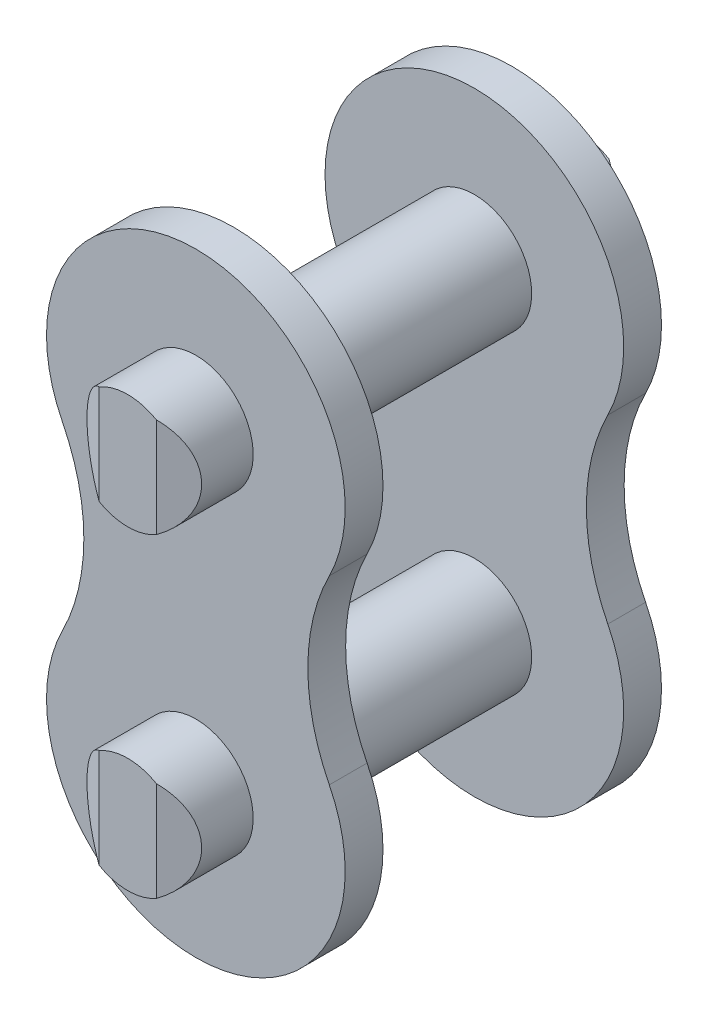
ISO-10303-21;
HEADER;
FILE_DESCRIPTION(('STEP AP214'),'2;1');
FILE_NAME('part.step','',(''),(''),'','','');
FILE_SCHEMA(('AUTOMOTIVE_DESIGN { 1 0 10303 214 1 1 1 1 }'));
ENDSEC;
DATA;
#1=APPLICATION_CONTEXT('core data for automotive mechanical design processes');
#2=APPLICATION_PROTOCOL_DEFINITION('international standard','automotive_design',2000,#1);
#3=PRODUCT_CONTEXT('',#1,'mechanical');
#4=PRODUCT('Part','Part','',(#3));
#5=PRODUCT_RELATED_PRODUCT_CATEGORY('part','',(#4));
#6=PRODUCT_DEFINITION_FORMATION('','',#4);
#7=PRODUCT_DEFINITION_CONTEXT('part definition',#1,'design');
#8=PRODUCT_DEFINITION('design','',#6,#7);
#9=PRODUCT_DEFINITION_SHAPE('','',#8);
#10=(LENGTH_UNIT() NAMED_UNIT(*) SI_UNIT(.MILLI.,.METRE.));
#11=(NAMED_UNIT(*) PLANE_ANGLE_UNIT() SI_UNIT($,.RADIAN.));
#12=(NAMED_UNIT(*) SI_UNIT($,.STERADIAN.) SOLID_ANGLE_UNIT());
#13=UNCERTAINTY_MEASURE_WITH_UNIT(LENGTH_MEASURE(1.E-05),#10,'distance_accuracy_value','');
#14=(GEOMETRIC_REPRESENTATION_CONTEXT(3) GLOBAL_UNCERTAINTY_ASSIGNED_CONTEXT((#13)) GLOBAL_UNIT_ASSIGNED_CONTEXT((#10,
#11,#12)) REPRESENTATION_CONTEXT('',''));
#15=CARTESIAN_POINT('',(0.,0.,0.));
#16=DIRECTION('',(0.,0.,1.));
#17=DIRECTION('',(1.,0.,0.));
#18=AXIS2_PLACEMENT_3D('',#15,#16,#17);
#19=CARTESIAN_POINT('',(81.9245250000066,718.446356901912,-131.392489073474));
#20=DIRECTION('',(0.5,0.,0.866025403784439));
#21=DIRECTION('',(0.,-1.,0.));
#22=AXIS2_PLACEMENT_3D('',#19,#20,#21);
#23=PLANE('',#22);
#24=CARTESIAN_POINT('',(82.7913000000066,732.949015752861,-131.892921853051));
#25=DIRECTION('',(-0.5,0.,-0.866025403784439));
#26=DIRECTION('',(-0.866025403784439,0.,0.5));
#27=AXIS2_PLACEMENT_3D('',#24,#25,#26);
#28=ELLIPSE('',#27,1.3344874122049,1.1557);
#29=CARTESIAN_POINT('',(82.2134500000066,731.948150193707,-131.5593));
#30=VERTEX_POINT('',#29);
#31=CARTESIAN_POINT('',(82.2134500000066,733.949881312015,-131.5593));
#32=VERTEX_POINT('',#31);
#33=EDGE_CURVE('E212',#30,#32,#28,.T.);
#34=ORIENTED_EDGE('',*,*,#33,.T.);
#35=DIRECTION('',(0.,1.,0.));
#36=VECTOR('',#35,1.);
#37=CARTESIAN_POINT('',(82.2134500000066,718.446356901912,-131.5593));
#38=LINE('',#37,#36);
#39=EDGE_CURVE('E354',#30,#32,#38,.T.);
#40=ORIENTED_EDGE('',*,*,#39,.F.);
#41=EDGE_LOOP('',(#34,#40));
#42=FACE_BOUND('',#41,.T.);
#43=ADVANCED_FACE('F17',(#42),#23,.F.);
#44=CARTESIAN_POINT('',(83.6580750000066,718.446356901912,-131.392489073474));
#45=DIRECTION('',(0.5,0.,-0.866025403784439));
#46=DIRECTION('',(0.,-1.,0.));
#47=AXIS2_PLACEMENT_3D('',#44,#45,#46);
#48=PLANE('',#47);
#49=CARTESIAN_POINT('',(82.7913000000066,732.949015752861,-131.892921853051));
#50=DIRECTION('',(-0.5,0.,0.866025403784439));
#51=DIRECTION('',(0.866025403784439,0.,0.5));
#52=AXIS2_PLACEMENT_3D('',#49,#50,#51);
#53=ELLIPSE('',#52,1.3344874122049,1.1557);
#54=CARTESIAN_POINT('',(83.3691500000066,731.948150193707,-131.5593));
#55=VERTEX_POINT('',#54);
#56=CARTESIAN_POINT('',(83.3691500000066,733.949881312015,-131.5593));
#57=VERTEX_POINT('',#56);
#58=EDGE_CURVE('E211',#55,#57,#53,.T.);
#59=ORIENTED_EDGE('',*,*,#58,.F.);
#60=DIRECTION('',(0.,1.,0.));
#61=VECTOR('',#60,1.);
#62=CARTESIAN_POINT('',(83.3691500000066,718.446356901912,-131.5593));
#63=LINE('',#62,#61);
#64=EDGE_CURVE('E358',#55,#57,#63,.T.);
#65=ORIENTED_EDGE('',*,*,#64,.T.);
#66=EDGE_LOOP('',(#59,#65));
#67=FACE_BOUND('',#66,.T.);
#68=ADVANCED_FACE('F425',(#67),#48,.T.);
#69=CARTESIAN_POINT('',(81.9245250000066,718.446356901912,-131.392489073474));
#70=DIRECTION('',(0.5,0.,0.866025403784439));
#71=DIRECTION('',(0.,-1.,0.));
#72=AXIS2_PLACEMENT_3D('',#69,#70,#71);
#73=PLANE('',#72);
#74=CARTESIAN_POINT('',(82.7913000000066,739.299015752861,-131.892921853051));
#75=DIRECTION('',(-0.5,0.,-0.866025403784439));
#76=DIRECTION('',(-0.866025403784439,0.,0.5));
#77=AXIS2_PLACEMENT_3D('',#74,#75,#76);
#78=ELLIPSE('',#77,1.3344874122049,1.1557);
#79=CARTESIAN_POINT('',(82.2134500000066,738.298150193707,-131.5593));
#80=VERTEX_POINT('',#79);
#81=CARTESIAN_POINT('',(82.2134500000066,740.299881312015,-131.5593));
#82=VERTEX_POINT('',#81);
#83=EDGE_CURVE('E307',#80,#82,#78,.T.);
#84=ORIENTED_EDGE('',*,*,#83,.T.);
#85=DIRECTION('',(0.,1.,0.));
#86=VECTOR('',#85,1.);
#87=CARTESIAN_POINT('',(82.2134500000066,718.446356901912,-131.5593));
#88=LINE('',#87,#86);
#89=EDGE_CURVE('E297',#80,#82,#88,.T.);
#90=ORIENTED_EDGE('',*,*,#89,.F.);
#91=EDGE_LOOP('',(#84,#90));
#92=FACE_BOUND('',#91,.T.);
#93=ADVANCED_FACE('F431',(#92),#73,.F.);
#94=CARTESIAN_POINT('',(83.6580750000066,718.446356901912,-131.392489073474));
#95=DIRECTION('',(0.5,0.,-0.866025403784439));
#96=DIRECTION('',(0.,-1.,0.));
#97=AXIS2_PLACEMENT_3D('',#94,#95,#96);
#98=PLANE('',#97);
#99=CARTESIAN_POINT('',(82.7913000000066,739.299015752861,-131.892921853051));
#100=DIRECTION('',(-0.5,0.,0.866025403784439));
#101=DIRECTION('',(0.866025403784439,0.,0.5));
#102=AXIS2_PLACEMENT_3D('',#99,#100,#101);
#103=ELLIPSE('',#102,1.3344874122049,1.1557);
#104=CARTESIAN_POINT('',(83.3691500000066,738.298150193707,-131.5593));
#105=VERTEX_POINT('',#104);
#106=CARTESIAN_POINT('',(83.3691500000066,740.299881312015,-131.5593));
#107=VERTEX_POINT('',#106);
#108=EDGE_CURVE('E306',#105,#107,#103,.T.);
#109=ORIENTED_EDGE('',*,*,#108,.F.);
#110=DIRECTION('',(0.,1.,0.));
#111=VECTOR('',#110,1.);
#112=CARTESIAN_POINT('',(83.3691500000066,718.446356901912,-131.5593));
#113=LINE('',#112,#111);
#114=EDGE_CURVE('E300',#105,#107,#113,.T.);
#115=ORIENTED_EDGE('',*,*,#114,.T.);
#116=EDGE_LOOP('',(#109,#115));
#117=FACE_BOUND('',#116,.T.);
#118=ADVANCED_FACE('F418',(#117),#98,.T.);
#119=CARTESIAN_POINT('',(82.7913000000066,736.124015752861,-129.4257));
#120=DIRECTION('',(0.,0.,-1.));
#121=DIRECTION('',(0.,-1.,0.));
#122=AXIS2_PLACEMENT_3D('',#119,#120,#121);
#123=PLANE('',#122);
#124=CARTESIAN_POINT('',(82.7913000000066,732.949015752861,-129.4257));
#125=DIRECTION('',(0.,0.,1.));
#126=DIRECTION('',(0.,1.,0.));
#127=AXIS2_PLACEMENT_3D('',#124,#125,#126);
#128=CIRCLE('',#127,1.1557);
#129=CARTESIAN_POINT('',(82.7913000000066,734.104715752861,-129.4257));
#130=VERTEX_POINT('',#129);
#131=EDGE_CURVE('E338',#130,#130,#128,.T.);
#132=ORIENTED_EDGE('',*,*,#131,.F.);
#133=EDGE_LOOP('',(#132));
#134=FACE_BOUND('',#133,.T.);
#135=CARTESIAN_POINT('',(82.7913000000066,739.299015752861,-129.4257));
#136=DIRECTION('',(0.,0.,1.));
#137=DIRECTION('',(0.,1.,0.));
#138=AXIS2_PLACEMENT_3D('',#135,#136,#137);
#139=CIRCLE('',#138,1.1557);
#140=CARTESIAN_POINT('',(82.7913000000066,740.454715752861,-129.4257));
#141=VERTEX_POINT('',#140);
#142=EDGE_CURVE('E335',#141,#141,#139,.T.);
#143=ORIENTED_EDGE('',*,*,#142,.F.);
#144=EDGE_LOOP('',(#143));
#145=FACE_BOUND('',#144,.T.);
#146=CARTESIAN_POINT('',(89.1133747362936,736.124015752861,-129.4257));
#147=DIRECTION('',(0.,0.,1.));
#148=DIRECTION('',(0.,1.,0.));
#149=AXIS2_PLACEMENT_3D('',#146,#147,#148);
#150=CIRCLE('',#149,4.06464973628698);
#151=CARTESIAN_POINT('',(85.4810560209654,737.948197275894,-129.4257));
#152=VERTEX_POINT('',#151);
#153=CARTESIAN_POINT('',(85.4810560209654,734.299834229828,-129.4257));
#154=VERTEX_POINT('',#153);
#155=EDGE_CURVE('E371',#152,#154,#150,.T.);
#156=ORIENTED_EDGE('',*,*,#155,.F.);
#157=CARTESIAN_POINT('',(82.7913000000066,739.299015752861,-129.4257));
#158=DIRECTION('',(0.,0.,1.));
#159=DIRECTION('',(0.,1.,0.));
#160=AXIS2_PLACEMENT_3D('',#157,#158,#159);
#161=CIRCLE('',#160,3.0099);
#162=CARTESIAN_POINT('',(80.1015439790479,737.948197275894,-129.4257));
#163=VERTEX_POINT('',#162);
#164=EDGE_CURVE('E287',#152,#163,#161,.T.);
#165=ORIENTED_EDGE('',*,*,#164,.T.);
#166=CARTESIAN_POINT('',(76.4692252637197,736.124015752861,-129.4257));
#167=DIRECTION('',(0.,0.,1.));
#168=DIRECTION('',(0.,1.,0.));
#169=AXIS2_PLACEMENT_3D('',#166,#167,#168);
#170=CIRCLE('',#169,4.06464973628691);
#171=CARTESIAN_POINT('',(80.1015439790479,734.299834229828,-129.4257));
#172=VERTEX_POINT('',#171);
#173=EDGE_CURVE('E282',#172,#163,#170,.T.);
#174=ORIENTED_EDGE('',*,*,#173,.F.);
#175=CARTESIAN_POINT('',(82.7913000000066,732.949015752861,-129.4257));
#176=DIRECTION('',(0.,0.,1.));
#177=DIRECTION('',(0.,1.,0.));
#178=AXIS2_PLACEMENT_3D('',#175,#176,#177);
#179=CIRCLE('',#178,3.0099);
#180=EDGE_CURVE('E25',#172,#154,#179,.T.);
#181=ORIENTED_EDGE('',*,*,#180,.T.);
#182=EDGE_LOOP('',(#156,#165,#174,#181));
#183=FACE_BOUND('',#182,.T.);
#184=ADVANCED_FACE('F395',(#134,#145,#183),#123,.F.);
#185=CARTESIAN_POINT('',(82.7913000000066,736.124015752861,-130.1877));
#186=DIRECTION('',(0.,0.,-1.));
#187=DIRECTION('',(0.,-1.,0.));
#188=AXIS2_PLACEMENT_3D('',#185,#186,#187);
#189=PLANE('',#188);
#190=CARTESIAN_POINT('',(82.7913000000066,732.949015752861,-130.1877));
#191=DIRECTION('',(0.,0.,1.));
#192=DIRECTION('',(0.,1.,0.));
#193=AXIS2_PLACEMENT_3D('',#190,#191,#192);
#194=CIRCLE('',#193,1.1557);
#195=CARTESIAN_POINT('',(82.7913000000066,734.104715752861,-130.1877));
#196=VERTEX_POINT('',#195);
#197=EDGE_CURVE('E341',#196,#196,#194,.T.);
#198=ORIENTED_EDGE('',*,*,#197,.T.);
#199=EDGE_LOOP('',(#198));
#200=FACE_BOUND('',#199,.T.);
#201=CARTESIAN_POINT('',(82.7913000000066,739.299015752861,-130.1877));
#202=DIRECTION('',(0.,0.,1.));
#203=DIRECTION('',(0.,1.,0.));
#204=AXIS2_PLACEMENT_3D('',#201,#202,#203);
#205=CIRCLE('',#204,1.1557);
#206=CARTESIAN_POINT('',(82.7913000000066,740.454715752861,-130.1877));
#207=VERTEX_POINT('',#206);
#208=EDGE_CURVE('E355',#207,#207,#205,.T.);
#209=ORIENTED_EDGE('',*,*,#208,.T.);
#210=EDGE_LOOP('',(#209));
#211=FACE_BOUND('',#210,.T.);
#212=CARTESIAN_POINT('',(89.1133747362936,736.124015752861,-130.1877));
#213=DIRECTION('',(0.,0.,1.));
#214=DIRECTION('',(0.,1.,0.));
#215=AXIS2_PLACEMENT_3D('',#212,#213,#214);
#216=CIRCLE('',#215,4.06464973628698);
#217=CARTESIAN_POINT('',(85.4810560209654,737.948197275894,-130.1877));
#218=VERTEX_POINT('',#217);
#219=CARTESIAN_POINT('',(85.4810560209654,734.299834229828,-130.1877));
#220=VERTEX_POINT('',#219);
#221=EDGE_CURVE('E293',#218,#220,#216,.T.);
#222=ORIENTED_EDGE('',*,*,#221,.T.);
#223=CARTESIAN_POINT('',(82.7913000000066,732.949015752861,-130.1877));
#224=DIRECTION('',(0.,0.,1.));
#225=DIRECTION('',(0.,1.,0.));
#226=AXIS2_PLACEMENT_3D('',#223,#224,#225);
#227=CIRCLE('',#226,3.0099);
#228=CARTESIAN_POINT('',(80.1015439790479,734.299834229828,-130.1877));
#229=VERTEX_POINT('',#228);
#230=EDGE_CURVE('E11',#229,#220,#227,.T.);
#231=ORIENTED_EDGE('',*,*,#230,.F.);
#232=CARTESIAN_POINT('',(76.4692252637197,736.124015752861,-130.1877));
#233=DIRECTION('',(0.,0.,1.));
#234=DIRECTION('',(0.,1.,0.));
#235=AXIS2_PLACEMENT_3D('',#232,#233,#234);
#236=CIRCLE('',#235,4.06464973628691);
#237=CARTESIAN_POINT('',(80.1015439790479,737.948197275894,-130.1877));
#238=VERTEX_POINT('',#237);
#239=EDGE_CURVE('E285',#229,#238,#236,.T.);
#240=ORIENTED_EDGE('',*,*,#239,.T.);
#241=CARTESIAN_POINT('',(82.7913000000066,739.299015752861,-130.1877));
#242=DIRECTION('',(0.,0.,1.));
#243=DIRECTION('',(0.,1.,0.));
#244=AXIS2_PLACEMENT_3D('',#241,#242,#243);
#245=CIRCLE('',#244,3.0099);
#246=EDGE_CURVE('E291',#218,#238,#245,.T.);
#247=ORIENTED_EDGE('',*,*,#246,.F.);
#248=EDGE_LOOP('',(#222,#231,#240,#247));
#249=FACE_BOUND('',#248,.T.);
#250=ADVANCED_FACE('F408',(#200,#211,#249),#189,.T.);
#251=CARTESIAN_POINT('',(82.7913000000066,732.949015752861,-130.1877));
#252=DIRECTION('',(0.,0.,1.));
#253=DIRECTION('',(0.,-1.,0.));
#254=AXIS2_PLACEMENT_3D('',#251,#252,#253);
#255=CYLINDRICAL_SURFACE('',#254,3.0099);
#256=ORIENTED_EDGE('',*,*,#180,.F.);
#257=DIRECTION('',(0.,0.,1.));
#258=VECTOR('',#257,1.);
#259=CARTESIAN_POINT('',(80.1015439790479,734.299834229828,-130.1877));
#260=LINE('',#259,#258);
#261=EDGE_CURVE('E388',#229,#172,#260,.T.);
#262=ORIENTED_EDGE('',*,*,#261,.F.);
#263=ORIENTED_EDGE('',*,*,#230,.T.);
#264=DIRECTION('',(0.,0.,1.));
#265=VECTOR('',#264,1.);
#266=CARTESIAN_POINT('',(85.4810560209654,734.299834229828,-130.1877));
#267=LINE('',#266,#265);
#268=EDGE_CURVE('E296',#220,#154,#267,.T.);
#269=ORIENTED_EDGE('',*,*,#268,.T.);
#270=EDGE_LOOP('',(#256,#262,#263,#269));
#271=FACE_BOUND('',#270,.T.);
#272=ADVANCED_FACE('F397',(#271),#255,.T.);
#273=CARTESIAN_POINT('',(76.4692252637197,736.124015752861,-130.1877));
#274=DIRECTION('',(0.,0.,1.));
#275=DIRECTION('',(0.,-1.,0.));
#276=AXIS2_PLACEMENT_3D('',#273,#274,#275);
#277=CYLINDRICAL_SURFACE('',#276,4.06464973628691);
#278=ORIENTED_EDGE('',*,*,#173,.T.);
#279=DIRECTION('',(0.,0.,1.));
#280=VECTOR('',#279,1.);
#281=CARTESIAN_POINT('',(80.1015439790479,737.948197275894,-130.1877));
#282=LINE('',#281,#280);
#283=EDGE_CURVE('E286',#238,#163,#282,.T.);
#284=ORIENTED_EDGE('',*,*,#283,.F.);
#285=ORIENTED_EDGE('',*,*,#239,.F.);
#286=ORIENTED_EDGE('',*,*,#261,.T.);
#287=EDGE_LOOP('',(#278,#284,#285,#286));
#288=FACE_BOUND('',#287,.T.);
#289=ADVANCED_FACE('F407',(#288),#277,.F.);
#290=CARTESIAN_POINT('',(82.7913000000066,739.299015752861,-130.1877));
#291=DIRECTION('',(0.,0.,1.));
#292=DIRECTION('',(0.,-1.,0.));
#293=AXIS2_PLACEMENT_3D('',#290,#291,#292);
#294=CYLINDRICAL_SURFACE('',#293,3.0099);
#295=ORIENTED_EDGE('',*,*,#164,.F.);
#296=DIRECTION('',(0.,0.,1.));
#297=VECTOR('',#296,1.);
#298=CARTESIAN_POINT('',(85.4810560209654,737.948197275894,-130.1877));
#299=LINE('',#298,#297);
#300=EDGE_CURVE('E292',#218,#152,#299,.T.);
#301=ORIENTED_EDGE('',*,*,#300,.F.);
#302=ORIENTED_EDGE('',*,*,#246,.T.);
#303=ORIENTED_EDGE('',*,*,#283,.T.);
#304=EDGE_LOOP('',(#295,#301,#302,#303));
#305=FACE_BOUND('',#304,.T.);
#306=ADVANCED_FACE('F403',(#305),#294,.T.);
#307=CARTESIAN_POINT('',(89.1133747362936,736.124015752861,-130.1877));
#308=DIRECTION('',(0.,0.,1.));
#309=DIRECTION('',(0.,-1.,0.));
#310=AXIS2_PLACEMENT_3D('',#307,#308,#309);
#311=CYLINDRICAL_SURFACE('',#310,4.06464973628698);
#312=ORIENTED_EDGE('',*,*,#155,.T.);
#313=ORIENTED_EDGE('',*,*,#268,.F.);
#314=ORIENTED_EDGE('',*,*,#221,.F.);
#315=ORIENTED_EDGE('',*,*,#300,.T.);
#316=EDGE_LOOP('',(#312,#313,#314,#315));
#317=FACE_BOUND('',#316,.T.);
#318=ADVANCED_FACE('F400',(#317),#311,.F.);
#319=CARTESIAN_POINT('',(82.7913000000066,736.124015752861,-131.5593));
#320=DIRECTION('',(0.,0.,-1.));
#321=DIRECTION('',(0.,-1.,0.));
#322=AXIS2_PLACEMENT_3D('',#319,#320,#321);
#323=PLANE('',#322);
#324=ORIENTED_EDGE('',*,*,#89,.T.);
#325=CARTESIAN_POINT('',(82.7913000000066,739.299015752861,-131.5593));
#326=DIRECTION('',(0.,0.,1.));
#327=DIRECTION('',(0.,1.,0.));
#328=AXIS2_PLACEMENT_3D('',#325,#326,#327);
#329=CIRCLE('',#328,1.1557);
#330=EDGE_CURVE('E301',#107,#82,#329,.T.);
#331=ORIENTED_EDGE('',*,*,#330,.F.);
#332=ORIENTED_EDGE('',*,*,#114,.F.);
#333=CARTESIAN_POINT('',(82.7913000000066,739.299015752861,-131.5593));
#334=DIRECTION('',(0.,0.,1.));
#335=DIRECTION('',(0.,1.,0.));
#336=AXIS2_PLACEMENT_3D('',#333,#334,#335);
#337=CIRCLE('',#336,1.1557);
#338=EDGE_CURVE('E302',#80,#105,#337,.T.);
#339=ORIENTED_EDGE('',*,*,#338,.F.);
#340=EDGE_LOOP('',(#324,#331,#332,#339));
#341=FACE_BOUND('',#340,.T.);
#342=ADVANCED_FACE('F451',(#341),#323,.T.);
#343=CARTESIAN_POINT('',(82.7913000000066,739.299015752861,-131.5593));
#344=DIRECTION('',(0.,0.,1.));
#345=DIRECTION('',(0.,-1.,0.));
#346=AXIS2_PLACEMENT_3D('',#343,#344,#345);
#347=CYLINDRICAL_SURFACE('',#346,1.1557);
#348=ORIENTED_EDGE('',*,*,#83,.F.);
#349=ORIENTED_EDGE('',*,*,#338,.T.);
#350=ORIENTED_EDGE('',*,*,#108,.T.);
#351=ORIENTED_EDGE('',*,*,#330,.T.);
#352=EDGE_LOOP('',(#348,#349,#350,#351));
#353=FACE_BOUND('',#352,.T.);
#354=ORIENTED_EDGE('',*,*,#208,.F.);
#355=EDGE_LOOP('',(#354));
#356=FACE_BOUND('',#355,.T.);
#357=ADVANCED_FACE('F443',(#353,#356),#347,.T.);
#358=CARTESIAN_POINT('',(82.7913000000066,736.124015752861,-131.5593));
#359=DIRECTION('',(0.,0.,-1.));
#360=DIRECTION('',(0.,-1.,0.));
#361=AXIS2_PLACEMENT_3D('',#358,#359,#360);
#362=PLANE('',#361);
#363=ORIENTED_EDGE('',*,*,#39,.T.);
#364=CARTESIAN_POINT('',(82.7913000000066,732.949015752861,-131.5593));
#365=DIRECTION('',(0.,0.,1.));
#366=DIRECTION('',(0.,1.,0.));
#367=AXIS2_PLACEMENT_3D('',#364,#365,#366);
#368=CIRCLE('',#367,1.1557);
#369=EDGE_CURVE('E350',#57,#32,#368,.T.);
#370=ORIENTED_EDGE('',*,*,#369,.F.);
#371=ORIENTED_EDGE('',*,*,#64,.F.);
#372=CARTESIAN_POINT('',(82.7913000000066,732.949015752861,-131.5593));
#373=DIRECTION('',(0.,0.,1.));
#374=DIRECTION('',(0.,1.,0.));
#375=AXIS2_PLACEMENT_3D('',#372,#373,#374);
#376=CIRCLE('',#375,1.1557);
#377=EDGE_CURVE('E209',#30,#55,#376,.T.);
#378=ORIENTED_EDGE('',*,*,#377,.F.);
#379=EDGE_LOOP('',(#363,#370,#371,#378));
#380=FACE_BOUND('',#379,.T.);
#381=ADVANCED_FACE('F441',(#380),#362,.T.);
#382=CARTESIAN_POINT('',(82.7913000000066,732.949015752861,-131.5593));
#383=DIRECTION('',(0.,0.,1.));
#384=DIRECTION('',(0.,-1.,0.));
#385=AXIS2_PLACEMENT_3D('',#382,#383,#384);
#386=CYLINDRICAL_SURFACE('',#385,1.1557);
#387=ORIENTED_EDGE('',*,*,#33,.F.);
#388=ORIENTED_EDGE('',*,*,#377,.T.);
#389=ORIENTED_EDGE('',*,*,#58,.T.);
#390=ORIENTED_EDGE('',*,*,#369,.T.);
#391=EDGE_LOOP('',(#387,#388,#389,#390));
#392=FACE_BOUND('',#391,.T.);
#393=ORIENTED_EDGE('',*,*,#197,.F.);
#394=EDGE_LOOP('',(#393));
#395=FACE_BOUND('',#394,.T.);
#396=ADVANCED_FACE('F436',(#392,#395),#386,.T.);
#397=CARTESIAN_POINT('',(81.9245250000066,718.446356901912,-122.607510926526));
#398=DIRECTION('',(0.5,0.,-0.866025403784439));
#399=DIRECTION('',(0.,-1.,0.));
#400=AXIS2_PLACEMENT_3D('',#397,#398,#399);
#401=PLANE('',#400);
#402=CARTESIAN_POINT('',(82.7913000000066,732.949015752861,-122.107078146949));
#403=DIRECTION('',(0.5,0.,-0.866025403784439));
#404=DIRECTION('',(-0.866025403784439,0.,-0.5));
#405=AXIS2_PLACEMENT_3D('',#402,#403,#404);
#406=ELLIPSE('',#405,1.3344874122049,1.1557);
#407=CARTESIAN_POINT('',(82.2134500000066,731.948150193707,-122.4407));
#408=VERTEX_POINT('',#407);
#409=CARTESIAN_POINT('',(82.2134500000066,733.949881312015,-122.4407));
#410=VERTEX_POINT('',#409);
#411=EDGE_CURVE('E200',#408,#410,#406,.T.);
#412=ORIENTED_EDGE('',*,*,#411,.F.);
#413=DIRECTION('',(0.,1.,0.));
#414=VECTOR('',#413,1.);
#415=CARTESIAN_POINT('',(82.2134500000066,718.446356901912,-122.4407));
#416=LINE('',#415,#414);
#417=EDGE_CURVE('E245',#408,#410,#416,.T.);
#418=ORIENTED_EDGE('',*,*,#417,.T.);
#419=EDGE_LOOP('',(#412,#418));
#420=FACE_BOUND('',#419,.T.);
#421=ADVANCED_FACE('F449',(#420),#401,.F.);
#422=CARTESIAN_POINT('',(83.6580750000066,718.446356901912,-122.607510926526));
#423=DIRECTION('',(0.5,0.,0.866025403784439));
#424=DIRECTION('',(0.,-1.,0.));
#425=AXIS2_PLACEMENT_3D('',#422,#423,#424);
#426=PLANE('',#425);
#427=CARTESIAN_POINT('',(82.7913000000066,732.949015752861,-122.107078146949));
#428=DIRECTION('',(0.5,0.,0.866025403784439));
#429=DIRECTION('',(0.866025403784439,0.,-0.5));
#430=AXIS2_PLACEMENT_3D('',#427,#428,#429);
#431=ELLIPSE('',#430,1.3344874122049,1.1557);
#432=CARTESIAN_POINT('',(83.3691500000066,731.948150193707,-122.4407));
#433=VERTEX_POINT('',#432);
#434=CARTESIAN_POINT('',(83.3691500000066,733.949881312015,-122.4407));
#435=VERTEX_POINT('',#434);
#436=EDGE_CURVE('E231',#433,#435,#431,.T.);
#437=ORIENTED_EDGE('',*,*,#436,.T.);
#438=DIRECTION('',(0.,1.,0.));
#439=VECTOR('',#438,1.);
#440=CARTESIAN_POINT('',(83.3691500000066,718.446356901912,-122.4407));
#441=LINE('',#440,#439);
#442=EDGE_CURVE('E253',#433,#435,#441,.T.);
#443=ORIENTED_EDGE('',*,*,#442,.F.);
#444=EDGE_LOOP('',(#437,#443));
#445=FACE_BOUND('',#444,.T.);
#446=ADVANCED_FACE('F561',(#445),#426,.T.);
#447=CARTESIAN_POINT('',(81.9245250000066,718.446356901912,-122.607510926526));
#448=DIRECTION('',(0.5,0.,-0.866025403784439));
#449=DIRECTION('',(0.,-1.,0.));
#450=AXIS2_PLACEMENT_3D('',#447,#448,#449);
#451=PLANE('',#450);
#452=CARTESIAN_POINT('',(82.7913000000066,739.299015752861,-122.107078146949));
#453=DIRECTION('',(0.5,0.,-0.866025403784439));
#454=DIRECTION('',(-0.866025403784439,0.,-0.5));
#455=AXIS2_PLACEMENT_3D('',#452,#453,#454);
#456=ELLIPSE('',#455,1.3344874122049,1.1557);
#457=CARTESIAN_POINT('',(82.2134500000066,738.298150193707,-122.4407));
#458=VERTEX_POINT('',#457);
#459=CARTESIAN_POINT('',(82.2134500000066,740.299881312015,-122.4407));
#460=VERTEX_POINT('',#459);
#461=EDGE_CURVE('E223',#458,#460,#456,.T.);
#462=ORIENTED_EDGE('',*,*,#461,.F.);
#463=DIRECTION('',(0.,1.,0.));
#464=VECTOR('',#463,1.);
#465=CARTESIAN_POINT('',(82.2134500000066,718.446356901912,-122.4407));
#466=LINE('',#465,#464);
#467=EDGE_CURVE('E261',#458,#460,#466,.T.);
#468=ORIENTED_EDGE('',*,*,#467,.T.);
#469=EDGE_LOOP('',(#462,#468));
#470=FACE_BOUND('',#469,.T.);
#471=ADVANCED_FACE('F571',(#470),#451,.F.);
#472=CARTESIAN_POINT('',(83.6580750000066,718.446356901912,-122.607510926526));
#473=DIRECTION('',(0.5,0.,0.866025403784439));
#474=DIRECTION('',(0.,-1.,0.));
#475=AXIS2_PLACEMENT_3D('',#472,#473,#474);
#476=PLANE('',#475);
#477=CARTESIAN_POINT('',(82.7913000000066,739.299015752861,-122.107078146949));
#478=DIRECTION('',(0.5,0.,0.866025403784439));
#479=DIRECTION('',(0.866025403784439,0.,-0.5));
#480=AXIS2_PLACEMENT_3D('',#477,#478,#479);
#481=ELLIPSE('',#480,1.3344874122049,1.1557);
#482=CARTESIAN_POINT('',(83.3691500000066,738.298150193707,-122.4407));
#483=VERTEX_POINT('',#482);
#484=CARTESIAN_POINT('',(83.3691500000066,740.299881312015,-122.4407));
#485=VERTEX_POINT('',#484);
#486=EDGE_CURVE('E214',#483,#485,#481,.T.);
#487=ORIENTED_EDGE('',*,*,#486,.T.);
#488=DIRECTION('',(0.,1.,0.));
#489=VECTOR('',#488,1.);
#490=CARTESIAN_POINT('',(83.3691500000066,718.446356901912,-122.4407));
#491=LINE('',#490,#489);
#492=EDGE_CURVE('E241',#483,#485,#491,.T.);
#493=ORIENTED_EDGE('',*,*,#492,.F.);
#494=EDGE_LOOP('',(#487,#493));
#495=FACE_BOUND('',#494,.T.);
#496=ADVANCED_FACE('F581',(#495),#476,.T.);
#497=CARTESIAN_POINT('',(82.7913000000066,732.949015752861,-122.4407));
#498=DIRECTION('',(0.,0.,-1.));
#499=DIRECTION('',(0.,-1.,0.));
#500=AXIS2_PLACEMENT_3D('',#497,#498,#499);
#501=CYLINDRICAL_SURFACE('',#500,1.1557);
#502=ORIENTED_EDGE('',*,*,#131,.T.);
#503=EDGE_LOOP('',(#502));
#504=FACE_BOUND('',#503,.T.);
#505=CARTESIAN_POINT('',(82.7913000000066,732.949015752861,-124.5743));
#506=DIRECTION('',(0.,0.,1.));
#507=DIRECTION('',(0.,1.,0.));
#508=AXIS2_PLACEMENT_3D('',#505,#506,#507);
#509=CIRCLE('',#508,1.1557);
#510=CARTESIAN_POINT('',(82.7913000000066,734.104715752861,-124.5743));
#511=VERTEX_POINT('',#510);
#512=EDGE_CURVE('E329',#511,#511,#509,.T.);
#513=ORIENTED_EDGE('',*,*,#512,.F.);
#514=EDGE_LOOP('',(#513));
#515=FACE_BOUND('',#514,.T.);
#516=ADVANCED_FACE('F590',(#504,#515),#501,.T.);
#517=CARTESIAN_POINT('',(82.7913000000066,739.299015752861,-122.4407));
#518=DIRECTION('',(0.,0.,-1.));
#519=DIRECTION('',(0.,-1.,0.));
#520=AXIS2_PLACEMENT_3D('',#517,#518,#519);
#521=CYLINDRICAL_SURFACE('',#520,1.1557);
#522=ORIENTED_EDGE('',*,*,#142,.T.);
#523=EDGE_LOOP('',(#522));
#524=FACE_BOUND('',#523,.T.);
#525=CARTESIAN_POINT('',(82.7913000000066,739.299015752861,-124.5743));
#526=DIRECTION('',(0.,0.,1.));
#527=DIRECTION('',(0.,1.,0.));
#528=AXIS2_PLACEMENT_3D('',#525,#526,#527);
#529=CIRCLE('',#528,1.1557);
#530=CARTESIAN_POINT('',(82.7913000000066,740.454715752861,-124.5743));
#531=VERTEX_POINT('',#530);
#532=EDGE_CURVE('E326',#531,#531,#529,.T.);
#533=ORIENTED_EDGE('',*,*,#532,.F.);
#534=EDGE_LOOP('',(#533));
#535=FACE_BOUND('',#534,.T.);
#536=ADVANCED_FACE('F601',(#524,#535),#521,.T.);
#537=CARTESIAN_POINT('',(82.7913000000066,736.124015752861,-124.5743));
#538=DIRECTION('',(0.,0.,1.));
#539=DIRECTION('',(1.,0.,0.));
#540=AXIS2_PLACEMENT_3D('',#537,#538,#539);
#541=PLANE('',#540);
#542=ORIENTED_EDGE('',*,*,#512,.T.);
#543=EDGE_LOOP('',(#542));
#544=FACE_BOUND('',#543,.T.);
#545=ORIENTED_EDGE('',*,*,#532,.T.);
#546=EDGE_LOOP('',(#545));
#547=FACE_BOUND('',#546,.T.);
#548=CARTESIAN_POINT('',(89.1133747362936,736.124015752861,-124.5743));
#549=DIRECTION('',(0.,0.,1.));
#550=DIRECTION('',(0.,1.,0.));
#551=AXIS2_PLACEMENT_3D('',#548,#549,#550);
#552=CIRCLE('',#551,4.06464973628698);
#553=CARTESIAN_POINT('',(85.4810560209654,737.948197275894,-124.5743));
#554=VERTEX_POINT('',#553);
#555=CARTESIAN_POINT('',(85.4810560209654,734.299834229828,-124.5743));
#556=VERTEX_POINT('',#555);
#557=EDGE_CURVE('E236',#554,#556,#552,.T.);
#558=ORIENTED_EDGE('',*,*,#557,.T.);
#559=CARTESIAN_POINT('',(82.7913000000066,732.949015752861,-124.5743));
#560=DIRECTION('',(0.,0.,1.));
#561=DIRECTION('',(0.,1.,0.));
#562=AXIS2_PLACEMENT_3D('',#559,#560,#561);
#563=CIRCLE('',#562,3.0099);
#564=CARTESIAN_POINT('',(80.1015439790479,734.299834229828,-124.5743));
#565=VERTEX_POINT('',#564);
#566=EDGE_CURVE('E249',#565,#556,#563,.T.);
#567=ORIENTED_EDGE('',*,*,#566,.F.);
#568=CARTESIAN_POINT('',(76.4692252637197,736.124015752861,-124.5743));
#569=DIRECTION('',(0.,0.,1.));
#570=DIRECTION('',(0.,1.,0.));
#571=AXIS2_PLACEMENT_3D('',#568,#569,#570);
#572=CIRCLE('',#571,4.06464973628691);
#573=CARTESIAN_POINT('',(80.1015439790479,737.948197275894,-124.5743));
#574=VERTEX_POINT('',#573);
#575=EDGE_CURVE('E315',#565,#574,#572,.T.);
#576=ORIENTED_EDGE('',*,*,#575,.T.);
#577=CARTESIAN_POINT('',(82.7913000000066,739.299015752861,-124.5743));
#578=DIRECTION('',(0.,0.,1.));
#579=DIRECTION('',(0.,1.,0.));
#580=AXIS2_PLACEMENT_3D('',#577,#578,#579);
#581=CIRCLE('',#580,3.0099);
#582=EDGE_CURVE('E277',#554,#574,#581,.T.);
#583=ORIENTED_EDGE('',*,*,#582,.F.);
#584=EDGE_LOOP('',(#558,#567,#576,#583));
#585=FACE_BOUND('',#584,.T.);
#586=ADVANCED_FACE('F611',(#544,#547,#585),#541,.F.);
#587=CARTESIAN_POINT('',(82.7913000000066,736.124015752861,-123.8123));
#588=DIRECTION('',(0.,0.,1.));
#589=DIRECTION('',(1.,0.,0.));
#590=AXIS2_PLACEMENT_3D('',#587,#588,#589);
#591=PLANE('',#590);
#592=CARTESIAN_POINT('',(82.7913000000066,732.949015752861,-123.8123));
#593=DIRECTION('',(0.,0.,1.));
#594=DIRECTION('',(0.,1.,0.));
#595=AXIS2_PLACEMENT_3D('',#592,#593,#594);
#596=CIRCLE('',#595,1.1557);
#597=CARTESIAN_POINT('',(82.7913000000066,734.104715752861,-123.8123));
#598=VERTEX_POINT('',#597);
#599=EDGE_CURVE('E196',#598,#598,#596,.T.);
#600=ORIENTED_EDGE('',*,*,#599,.F.);
#601=EDGE_LOOP('',(#600));
#602=FACE_BOUND('',#601,.T.);
#603=CARTESIAN_POINT('',(82.7913000000066,739.299015752861,-123.8123));
#604=DIRECTION('',(0.,0.,1.));
#605=DIRECTION('',(0.,1.,0.));
#606=AXIS2_PLACEMENT_3D('',#603,#604,#605);
#607=CIRCLE('',#606,1.1557);
#608=CARTESIAN_POINT('',(82.7913000000066,740.454715752861,-123.8123));
#609=VERTEX_POINT('',#608);
#610=EDGE_CURVE('E227',#609,#609,#607,.T.);
#611=ORIENTED_EDGE('',*,*,#610,.F.);
#612=EDGE_LOOP('',(#611));
#613=FACE_BOUND('',#612,.T.);
#614=CARTESIAN_POINT('',(89.1133747362936,736.124015752861,-123.8123));
#615=DIRECTION('',(0.,0.,1.));
#616=DIRECTION('',(0.,1.,0.));
#617=AXIS2_PLACEMENT_3D('',#614,#615,#616);
#618=CIRCLE('',#617,4.06464973628698);
#619=CARTESIAN_POINT('',(85.4810560209654,737.948197275894,-123.8123));
#620=VERTEX_POINT('',#619);
#621=CARTESIAN_POINT('',(85.4810560209654,734.299834229828,-123.8123));
#622=VERTEX_POINT('',#621);
#623=EDGE_CURVE('E269',#620,#622,#618,.T.);
#624=ORIENTED_EDGE('',*,*,#623,.F.);
#625=CARTESIAN_POINT('',(82.7913000000066,739.299015752861,-123.8123));
#626=DIRECTION('',(0.,0.,1.));
#627=DIRECTION('',(0.,1.,0.));
#628=AXIS2_PLACEMENT_3D('',#625,#626,#627);
#629=CIRCLE('',#628,3.0099);
#630=CARTESIAN_POINT('',(80.1015439790479,737.948197275894,-123.8123));
#631=VERTEX_POINT('',#630);
#632=EDGE_CURVE('E311',#620,#631,#629,.T.);
#633=ORIENTED_EDGE('',*,*,#632,.T.);
#634=CARTESIAN_POINT('',(76.4692252637197,736.124015752861,-123.8123));
#635=DIRECTION('',(0.,0.,1.));
#636=DIRECTION('',(0.,1.,0.));
#637=AXIS2_PLACEMENT_3D('',#634,#635,#636);
#638=CIRCLE('',#637,4.06464973628691);
#639=CARTESIAN_POINT('',(80.1015439790479,734.299834229828,-123.8123));
#640=VERTEX_POINT('',#639);
#641=EDGE_CURVE('E246',#640,#631,#638,.T.);
#642=ORIENTED_EDGE('',*,*,#641,.F.);
#643=CARTESIAN_POINT('',(82.7913000000066,732.949015752861,-123.8123));
#644=DIRECTION('',(0.,0.,1.));
#645=DIRECTION('',(0.,1.,0.));
#646=AXIS2_PLACEMENT_3D('',#643,#644,#645);
#647=CIRCLE('',#646,3.0099);
#648=EDGE_CURVE('E323',#640,#622,#647,.T.);
#649=ORIENTED_EDGE('',*,*,#648,.T.);
#650=EDGE_LOOP('',(#624,#633,#642,#649));
#651=FACE_BOUND('',#650,.T.);
#652=ADVANCED_FACE('F623',(#602,#613,#651),#591,.T.);
#653=CARTESIAN_POINT('',(82.7913000000066,732.949015752861,-123.8123));
#654=DIRECTION('',(0.,0.,-1.));
#655=DIRECTION('',(0.,-1.,0.));
#656=AXIS2_PLACEMENT_3D('',#653,#654,#655);
#657=CYLINDRICAL_SURFACE('',#656,3.0099);
#658=ORIENTED_EDGE('',*,*,#566,.T.);
#659=DIRECTION('',(0.,0.,-1.));
#660=VECTOR('',#659,1.);
#661=CARTESIAN_POINT('',(85.4810560209654,734.299834229828,-123.8123));
#662=LINE('',#661,#660);
#663=EDGE_CURVE('E273',#622,#556,#662,.T.);
#664=ORIENTED_EDGE('',*,*,#663,.F.);
#665=ORIENTED_EDGE('',*,*,#648,.F.);
#666=DIRECTION('',(0.,0.,-1.));
#667=VECTOR('',#666,1.);
#668=CARTESIAN_POINT('',(80.1015439790479,734.299834229828,-123.8123));
#669=LINE('',#668,#667);
#670=EDGE_CURVE('E250',#640,#565,#669,.T.);
#671=ORIENTED_EDGE('',*,*,#670,.T.);
#672=EDGE_LOOP('',(#658,#664,#665,#671));
#673=FACE_BOUND('',#672,.T.);
#674=ADVANCED_FACE('F635',(#673),#657,.T.);
#675=CARTESIAN_POINT('',(76.4692252637197,736.124015752861,-123.8123));
#676=DIRECTION('',(0.,0.,-1.));
#677=DIRECTION('',(0.,-1.,0.));
#678=AXIS2_PLACEMENT_3D('',#675,#676,#677);
#679=CYLINDRICAL_SURFACE('',#678,4.06464973628691);
#680=ORIENTED_EDGE('',*,*,#575,.F.);
#681=ORIENTED_EDGE('',*,*,#670,.F.);
#682=ORIENTED_EDGE('',*,*,#641,.T.);
#683=DIRECTION('',(0.,0.,-1.));
#684=VECTOR('',#683,1.);
#685=CARTESIAN_POINT('',(80.1015439790479,737.948197275894,-123.8123));
#686=LINE('',#685,#684);
#687=EDGE_CURVE('E281',#631,#574,#686,.T.);
#688=ORIENTED_EDGE('',*,*,#687,.T.);
#689=EDGE_LOOP('',(#680,#681,#682,#688));
#690=FACE_BOUND('',#689,.T.);
#691=ADVANCED_FACE('F646',(#690),#679,.F.);
#692=CARTESIAN_POINT('',(82.7913000000066,739.299015752861,-123.8123));
#693=DIRECTION('',(0.,0.,-1.));
#694=DIRECTION('',(0.,-1.,0.));
#695=AXIS2_PLACEMENT_3D('',#692,#693,#694);
#696=CYLINDRICAL_SURFACE('',#695,3.0099);
#697=ORIENTED_EDGE('',*,*,#582,.T.);
#698=ORIENTED_EDGE('',*,*,#687,.F.);
#699=ORIENTED_EDGE('',*,*,#632,.F.);
#700=DIRECTION('',(0.,0.,-1.));
#701=VECTOR('',#700,1.);
#702=CARTESIAN_POINT('',(85.4810560209654,737.948197275894,-123.8123));
#703=LINE('',#702,#701);
#704=EDGE_CURVE('E240',#620,#554,#703,.T.);
#705=ORIENTED_EDGE('',*,*,#704,.T.);
#706=EDGE_LOOP('',(#697,#698,#699,#705));
#707=FACE_BOUND('',#706,.T.);
#708=ADVANCED_FACE('F658',(#707),#696,.T.);
#709=CARTESIAN_POINT('',(89.1133747362936,736.124015752861,-123.8123));
#710=DIRECTION('',(0.,0.,-1.));
#711=DIRECTION('',(0.,-1.,0.));
#712=AXIS2_PLACEMENT_3D('',#709,#710,#711);
#713=CYLINDRICAL_SURFACE('',#712,4.06464973628698);
#714=ORIENTED_EDGE('',*,*,#557,.F.);
#715=ORIENTED_EDGE('',*,*,#704,.F.);
#716=ORIENTED_EDGE('',*,*,#623,.T.);
#717=ORIENTED_EDGE('',*,*,#663,.T.);
#718=EDGE_LOOP('',(#714,#715,#716,#717));
#719=FACE_BOUND('',#718,.T.);
#720=ADVANCED_FACE('F670',(#719),#713,.F.);
#721=CARTESIAN_POINT('',(82.7913000000066,736.124015752861,-122.4407));
#722=DIRECTION('',(0.,0.,1.));
#723=DIRECTION('',(1.,0.,0.));
#724=AXIS2_PLACEMENT_3D('',#721,#722,#723);
#725=PLANE('',#724);
#726=ORIENTED_EDGE('',*,*,#467,.F.);
#727=CARTESIAN_POINT('',(82.7913000000066,739.299015752861,-122.4407));
#728=DIRECTION('',(0.,0.,1.));
#729=DIRECTION('',(0.,1.,0.));
#730=AXIS2_PLACEMENT_3D('',#727,#728,#729);
#731=CIRCLE('',#730,1.1557);
#732=EDGE_CURVE('E218',#458,#483,#731,.T.);
#733=ORIENTED_EDGE('',*,*,#732,.T.);
#734=ORIENTED_EDGE('',*,*,#492,.T.);
#735=CARTESIAN_POINT('',(82.7913000000066,739.299015752861,-122.4407));
#736=DIRECTION('',(0.,0.,1.));
#737=DIRECTION('',(0.,1.,0.));
#738=AXIS2_PLACEMENT_3D('',#735,#736,#737);
#739=CIRCLE('',#738,1.1557);
#740=EDGE_CURVE('E219',#485,#460,#739,.T.);
#741=ORIENTED_EDGE('',*,*,#740,.T.);
#742=EDGE_LOOP('',(#726,#733,#734,#741));
#743=FACE_BOUND('',#742,.T.);
#744=ADVANCED_FACE('F682',(#743),#725,.T.);
#745=CARTESIAN_POINT('',(82.7913000000066,739.299015752861,-122.4407));
#746=DIRECTION('',(0.,0.,-1.));
#747=DIRECTION('',(0.,-1.,0.));
#748=AXIS2_PLACEMENT_3D('',#745,#746,#747);
#749=CYLINDRICAL_SURFACE('',#748,1.1557);
#750=ORIENTED_EDGE('',*,*,#461,.T.);
#751=ORIENTED_EDGE('',*,*,#740,.F.);
#752=ORIENTED_EDGE('',*,*,#486,.F.);
#753=ORIENTED_EDGE('',*,*,#732,.F.);
#754=EDGE_LOOP('',(#750,#751,#752,#753));
#755=FACE_BOUND('',#754,.T.);
#756=ORIENTED_EDGE('',*,*,#610,.T.);
#757=EDGE_LOOP('',(#756));
#758=FACE_BOUND('',#757,.T.);
#759=ADVANCED_FACE('F692',(#755,#758),#749,.T.);
#760=CARTESIAN_POINT('',(82.7913000000066,736.124015752861,-122.4407));
#761=DIRECTION('',(0.,0.,1.));
#762=DIRECTION('',(1.,0.,0.));
#763=AXIS2_PLACEMENT_3D('',#760,#761,#762);
#764=PLANE('',#763);
#765=ORIENTED_EDGE('',*,*,#417,.F.);
#766=CARTESIAN_POINT('',(82.7913000000066,732.949015752861,-122.4407));
#767=DIRECTION('',(0.,0.,1.));
#768=DIRECTION('',(0.,1.,0.));
#769=AXIS2_PLACEMENT_3D('',#766,#767,#768);
#770=CIRCLE('',#769,1.1557);
#771=EDGE_CURVE('E235',#408,#433,#770,.T.);
#772=ORIENTED_EDGE('',*,*,#771,.T.);
#773=ORIENTED_EDGE('',*,*,#442,.T.);
#774=CARTESIAN_POINT('',(82.7913000000066,732.949015752861,-122.4407));
#775=DIRECTION('',(0.,0.,1.));
#776=DIRECTION('',(0.,1.,0.));
#777=AXIS2_PLACEMENT_3D('',#774,#775,#776);
#778=CIRCLE('',#777,1.1557);
#779=EDGE_CURVE('E206',#435,#410,#778,.T.);
#780=ORIENTED_EDGE('',*,*,#779,.T.);
#781=EDGE_LOOP('',(#765,#772,#773,#780));
#782=FACE_BOUND('',#781,.T.);
#783=ADVANCED_FACE('F701',(#782),#764,.T.);
#784=CARTESIAN_POINT('',(82.7913000000066,732.949015752861,-122.4407));
#785=DIRECTION('',(0.,0.,-1.));
#786=DIRECTION('',(0.,-1.,0.));
#787=AXIS2_PLACEMENT_3D('',#784,#785,#786);
#788=CYLINDRICAL_SURFACE('',#787,1.1557);
#789=ORIENTED_EDGE('',*,*,#411,.T.);
#790=ORIENTED_EDGE('',*,*,#779,.F.);
#791=ORIENTED_EDGE('',*,*,#436,.F.);
#792=ORIENTED_EDGE('',*,*,#771,.F.);
#793=EDGE_LOOP('',(#789,#790,#791,#792));
#794=FACE_BOUND('',#793,.T.);
#795=ORIENTED_EDGE('',*,*,#599,.T.);
#796=EDGE_LOOP('',(#795));
#797=FACE_BOUND('',#796,.T.);
#798=ADVANCED_FACE('F197',(#794,#797),#788,.T.);
#799=CLOSED_SHELL('',(#43,#68,#93,#118,#184,#250,#272,#289,#306,#318,#342,#357,#381,#396,#421,
#446,#471,#496,#516,#536,#586,#652,#674,#691,#708,#720,#744,#759,#783,#798));
#800=MANIFOLD_SOLID_BREP('B1',#799);
#801=ADVANCED_BREP_SHAPE_REPRESENTATION('',(#18,#800),#14);
#802=SHAPE_DEFINITION_REPRESENTATION(#9,#801);
ENDSEC;
END-ISO-10303-21;
